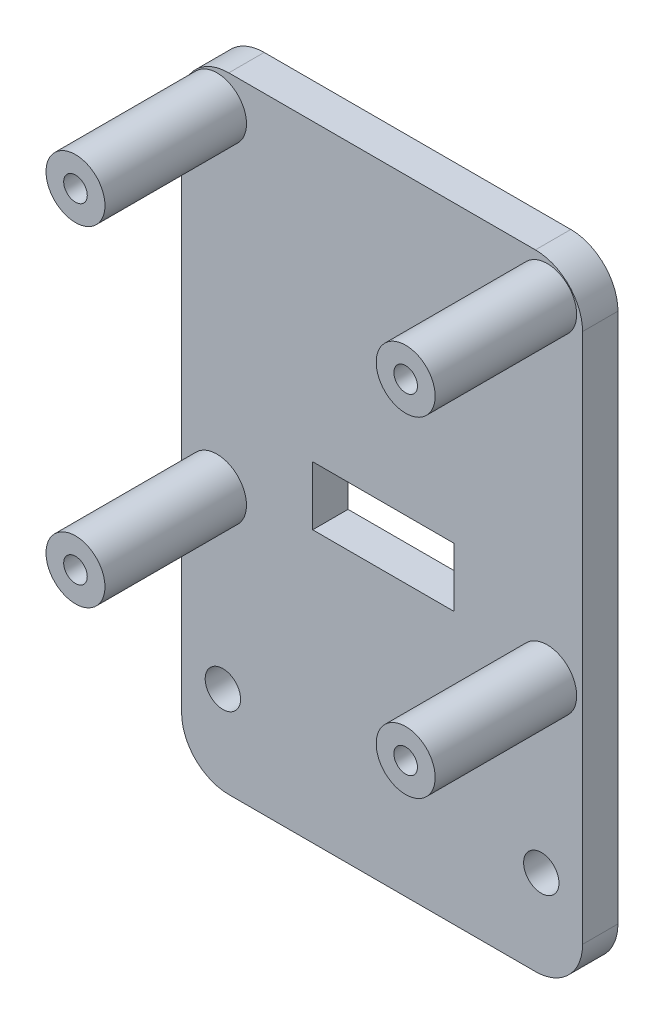
ISO-10303-21;
HEADER;
FILE_DESCRIPTION(('STEP AP214'),'2;1');
FILE_NAME('part.step','',(''),(''),'','','');
FILE_SCHEMA(('AUTOMOTIVE_DESIGN { 1 0 10303 214 1 1 1 1 }'));
ENDSEC;
DATA;
#1=APPLICATION_CONTEXT('core data for automotive mechanical design processes');
#2=APPLICATION_PROTOCOL_DEFINITION('international standard','automotive_design',2000,#1);
#3=PRODUCT_CONTEXT('',#1,'mechanical');
#4=PRODUCT('Part','Part','',(#3));
#5=PRODUCT_RELATED_PRODUCT_CATEGORY('part','',(#4));
#6=PRODUCT_DEFINITION_FORMATION('','',#4);
#7=PRODUCT_DEFINITION_CONTEXT('part definition',#1,'design');
#8=PRODUCT_DEFINITION('design','',#6,#7);
#9=PRODUCT_DEFINITION_SHAPE('','',#8);
#10=(LENGTH_UNIT() NAMED_UNIT(*) SI_UNIT(.MILLI.,.METRE.));
#11=(NAMED_UNIT(*) PLANE_ANGLE_UNIT() SI_UNIT($,.RADIAN.));
#12=(NAMED_UNIT(*) SI_UNIT($,.STERADIAN.) SOLID_ANGLE_UNIT());
#13=UNCERTAINTY_MEASURE_WITH_UNIT(LENGTH_MEASURE(1.E-05),#10,'distance_accuracy_value','');
#14=(GEOMETRIC_REPRESENTATION_CONTEXT(3) GLOBAL_UNCERTAINTY_ASSIGNED_CONTEXT((#13)) GLOBAL_UNIT_ASSIGNED_CONTEXT((#10,
#11,#12)) REPRESENTATION_CONTEXT('',''));
#15=CARTESIAN_POINT('',(0.,0.,0.));
#16=DIRECTION('',(0.,0.,1.));
#17=DIRECTION('',(1.,0.,0.));
#18=AXIS2_PLACEMENT_3D('',#15,#16,#17);
#19=CARTESIAN_POINT('',(-17.,0.,3.));
#20=DIRECTION('',(-1.,0.,0.));
#21=DIRECTION('',(0.,0.,1.));
#22=AXIS2_PLACEMENT_3D('',#19,#20,#21);
#23=PLANE('',#22);
#24=DIRECTION('',(0.,1.,0.));
#25=VECTOR('',#24,1.);
#26=CARTESIAN_POINT('',(-17.,0.,0.));
#27=LINE('',#26,#25);
#28=CARTESIAN_POINT('',(-17.,-3.5,0.));
#29=VERTEX_POINT('',#28);
#30=CARTESIAN_POINT('',(-17.,41.5,0.));
#31=VERTEX_POINT('',#30);
#32=EDGE_CURVE('E200',#29,#31,#27,.T.);
#33=ORIENTED_EDGE('',*,*,#32,.F.);
#34=DIRECTION('',(0.,0.,-1.));
#35=VECTOR('',#34,1.);
#36=CARTESIAN_POINT('',(-17.,-3.5,3.));
#37=LINE('',#36,#35);
#38=CARTESIAN_POINT('',(-17.,-3.5,3.));
#39=VERTEX_POINT('',#38);
#40=EDGE_CURVE('E267',#29,#39,#37,.F.);
#41=ORIENTED_EDGE('',*,*,#40,.T.);
#42=DIRECTION('',(0.,1.,0.));
#43=VECTOR('',#42,1.);
#44=CARTESIAN_POINT('',(-17.,0.,3.));
#45=LINE('',#44,#43);
#46=CARTESIAN_POINT('',(-17.,41.5,3.));
#47=VERTEX_POINT('',#46);
#48=EDGE_CURVE('E203',#39,#47,#45,.T.);
#49=ORIENTED_EDGE('',*,*,#48,.T.);
#50=DIRECTION('',(0.,0.,-1.));
#51=VECTOR('',#50,1.);
#52=CARTESIAN_POINT('',(-17.,41.5,3.));
#53=LINE('',#52,#51);
#54=EDGE_CURVE('E264',#47,#31,#53,.T.);
#55=ORIENTED_EDGE('',*,*,#54,.T.);
#56=EDGE_LOOP('',(#33,#41,#49,#55));
#57=FACE_BOUND('',#56,.T.);
#58=ADVANCED_FACE('F37',(#57),#23,.T.);
#59=CARTESIAN_POINT('',(0.,-7.5,3.));
#60=DIRECTION('',(0.,1.,0.));
#61=DIRECTION('',(0.,0.,1.));
#62=AXIS2_PLACEMENT_3D('',#59,#60,#61);
#63=PLANE('',#62);
#64=DIRECTION('',(1.,0.,0.));
#65=VECTOR('',#64,1.);
#66=CARTESIAN_POINT('',(0.,-7.5,0.));
#67=LINE('',#66,#65);
#68=CARTESIAN_POINT('',(-13.,-7.5,0.));
#69=VERTEX_POINT('',#68);
#70=CARTESIAN_POINT('',(13.,-7.5,0.));
#71=VERTEX_POINT('',#70);
#72=EDGE_CURVE('E225',#69,#71,#67,.T.);
#73=ORIENTED_EDGE('',*,*,#72,.T.);
#74=DIRECTION('',(0.,0.,-1.));
#75=VECTOR('',#74,1.);
#76=CARTESIAN_POINT('',(13.,-7.5,3.));
#77=LINE('',#76,#75);
#78=CARTESIAN_POINT('',(13.,-7.5,3.));
#79=VERTEX_POINT('',#78);
#80=EDGE_CURVE('E254',#71,#79,#77,.F.);
#81=ORIENTED_EDGE('',*,*,#80,.T.);
#82=DIRECTION('',(1.,0.,0.));
#83=VECTOR('',#82,1.);
#84=CARTESIAN_POINT('',(0.,-7.5,3.));
#85=LINE('',#84,#83);
#86=CARTESIAN_POINT('',(-13.,-7.5,3.));
#87=VERTEX_POINT('',#86);
#88=EDGE_CURVE('E206',#87,#79,#85,.T.);
#89=ORIENTED_EDGE('',*,*,#88,.F.);
#90=DIRECTION('',(0.,0.,-1.));
#91=VECTOR('',#90,1.);
#92=CARTESIAN_POINT('',(-13.,-7.5,0.));
#93=LINE('',#92,#91);
#94=EDGE_CURVE('E251',#87,#69,#93,.T.);
#95=ORIENTED_EDGE('',*,*,#94,.T.);
#96=EDGE_LOOP('',(#73,#81,#89,#95));
#97=FACE_BOUND('',#96,.T.);
#98=ADVANCED_FACE('F296',(#97),#63,.F.);
#99=CARTESIAN_POINT('',(17.,0.,3.));
#100=DIRECTION('',(-1.,0.,0.));
#101=DIRECTION('',(0.,0.,1.));
#102=AXIS2_PLACEMENT_3D('',#99,#100,#101);
#103=PLANE('',#102);
#104=DIRECTION('',(0.,1.,0.));
#105=VECTOR('',#104,1.);
#106=CARTESIAN_POINT('',(17.,0.,3.));
#107=LINE('',#106,#105);
#108=CARTESIAN_POINT('',(17.,-3.5,3.));
#109=VERTEX_POINT('',#108);
#110=CARTESIAN_POINT('',(17.,41.5,3.));
#111=VERTEX_POINT('',#110);
#112=EDGE_CURVE('E210',#109,#111,#107,.T.);
#113=ORIENTED_EDGE('',*,*,#112,.F.);
#114=DIRECTION('',(0.,0.,-1.));
#115=VECTOR('',#114,1.);
#116=CARTESIAN_POINT('',(17.,-3.5,3.));
#117=LINE('',#116,#115);
#118=CARTESIAN_POINT('',(17.,-3.5,0.));
#119=VERTEX_POINT('',#118);
#120=EDGE_CURVE('E240',#109,#119,#117,.T.);
#121=ORIENTED_EDGE('',*,*,#120,.T.);
#122=DIRECTION('',(0.,1.,0.));
#123=VECTOR('',#122,1.);
#124=CARTESIAN_POINT('',(17.,0.,0.));
#125=LINE('',#124,#123);
#126=CARTESIAN_POINT('',(17.,41.5,0.));
#127=VERTEX_POINT('',#126);
#128=EDGE_CURVE('E228',#119,#127,#125,.T.);
#129=ORIENTED_EDGE('',*,*,#128,.T.);
#130=DIRECTION('',(0.,0.,-1.));
#131=VECTOR('',#130,1.);
#132=CARTESIAN_POINT('',(17.,41.5,3.));
#133=LINE('',#132,#131);
#134=EDGE_CURVE('E222',#127,#111,#133,.F.);
#135=ORIENTED_EDGE('',*,*,#134,.T.);
#136=EDGE_LOOP('',(#113,#121,#129,#135));
#137=FACE_BOUND('',#136,.T.);
#138=ADVANCED_FACE('F302',(#137),#103,.F.);
#139=CARTESIAN_POINT('',(13.5,0.,3.));
#140=DIRECTION('',(0.,0.,-1.));
#141=DIRECTION('',(-1.,0.,0.));
#142=AXIS2_PLACEMENT_3D('',#139,#140,#141);
#143=CYLINDRICAL_SURFACE('',#142,1.5);
#144=CARTESIAN_POINT('',(13.5,0.,3.));
#145=DIRECTION('',(0.,0.,1.));
#146=DIRECTION('',(1.,0.,0.));
#147=AXIS2_PLACEMENT_3D('',#144,#145,#146);
#148=CIRCLE('',#147,1.5);
#149=CARTESIAN_POINT('',(15.,0.,3.));
#150=VERTEX_POINT('',#149);
#151=EDGE_CURVE('E216',#150,#150,#148,.T.);
#152=ORIENTED_EDGE('',*,*,#151,.T.);
#153=EDGE_LOOP('',(#152));
#154=FACE_BOUND('',#153,.T.);
#155=CARTESIAN_POINT('',(13.5,0.,0.));
#156=DIRECTION('',(0.,0.,1.));
#157=DIRECTION('',(1.,0.,0.));
#158=AXIS2_PLACEMENT_3D('',#155,#156,#157);
#159=CIRCLE('',#158,1.5);
#160=CARTESIAN_POINT('',(15.,0.,0.));
#161=VERTEX_POINT('',#160);
#162=EDGE_CURVE('E234',#161,#161,#159,.T.);
#163=ORIENTED_EDGE('',*,*,#162,.F.);
#164=EDGE_LOOP('',(#163));
#165=FACE_BOUND('',#164,.T.);
#166=ADVANCED_FACE('F361',(#154,#165),#143,.F.);
#167=CARTESIAN_POINT('',(0.,45.5,3.));
#168=DIRECTION('',(0.,1.,0.));
#169=DIRECTION('',(0.,0.,1.));
#170=AXIS2_PLACEMENT_3D('',#167,#168,#169);
#171=PLANE('',#170);
#172=DIRECTION('',(1.,0.,0.));
#173=VECTOR('',#172,1.);
#174=CARTESIAN_POINT('',(0.,45.5,3.));
#175=LINE('',#174,#173);
#176=CARTESIAN_POINT('',(-13.,45.5,3.));
#177=VERTEX_POINT('',#176);
#178=CARTESIAN_POINT('',(13.,45.5,3.));
#179=VERTEX_POINT('',#178);
#180=EDGE_CURVE('E213',#177,#179,#175,.T.);
#181=ORIENTED_EDGE('',*,*,#180,.T.);
#182=DIRECTION('',(0.,0.,-1.));
#183=VECTOR('',#182,1.);
#184=CARTESIAN_POINT('',(13.,45.5,0.));
#185=LINE('',#184,#183);
#186=CARTESIAN_POINT('',(13.,45.5,0.));
#187=VERTEX_POINT('',#186);
#188=EDGE_CURVE('E271',#179,#187,#185,.T.);
#189=ORIENTED_EDGE('',*,*,#188,.T.);
#190=DIRECTION('',(1.,0.,0.));
#191=VECTOR('',#190,1.);
#192=CARTESIAN_POINT('',(0.,45.5,0.));
#193=LINE('',#192,#191);
#194=CARTESIAN_POINT('',(-13.,45.5,0.));
#195=VERTEX_POINT('',#194);
#196=EDGE_CURVE('E231',#195,#187,#193,.T.);
#197=ORIENTED_EDGE('',*,*,#196,.F.);
#198=DIRECTION('',(0.,0.,-1.));
#199=VECTOR('',#198,1.);
#200=CARTESIAN_POINT('',(-13.,45.5,3.));
#201=LINE('',#200,#199);
#202=EDGE_CURVE('E269',#195,#177,#201,.F.);
#203=ORIENTED_EDGE('',*,*,#202,.T.);
#204=EDGE_LOOP('',(#181,#189,#197,#203));
#205=FACE_BOUND('',#204,.T.);
#206=ADVANCED_FACE('F329',(#205),#171,.T.);
#207=CARTESIAN_POINT('',(-13.5,0.,3.));
#208=DIRECTION('',(0.,0.,-1.));
#209=DIRECTION('',(-1.,0.,0.));
#210=AXIS2_PLACEMENT_3D('',#207,#208,#209);
#211=CYLINDRICAL_SURFACE('',#210,1.5);
#212=CARTESIAN_POINT('',(-13.5,0.,3.));
#213=DIRECTION('',(0.,0.,1.));
#214=DIRECTION('',(1.,0.,0.));
#215=AXIS2_PLACEMENT_3D('',#212,#213,#214);
#216=CIRCLE('',#215,1.5);
#217=CARTESIAN_POINT('',(-12.,0.,3.));
#218=VERTEX_POINT('',#217);
#219=EDGE_CURVE('E219',#218,#218,#216,.T.);
#220=ORIENTED_EDGE('',*,*,#219,.T.);
#221=EDGE_LOOP('',(#220));
#222=FACE_BOUND('',#221,.T.);
#223=CARTESIAN_POINT('',(-13.5,0.,0.));
#224=DIRECTION('',(0.,0.,1.));
#225=DIRECTION('',(1.,0.,0.));
#226=AXIS2_PLACEMENT_3D('',#223,#224,#225);
#227=CIRCLE('',#226,1.5);
#228=CARTESIAN_POINT('',(-12.,0.,0.));
#229=VERTEX_POINT('',#228);
#230=EDGE_CURVE('E207',#229,#229,#227,.T.);
#231=ORIENTED_EDGE('',*,*,#230,.F.);
#232=EDGE_LOOP('',(#231));
#233=FACE_BOUND('',#232,.T.);
#234=ADVANCED_FACE('F352',(#222,#233),#211,.F.);
#235=CARTESIAN_POINT('',(0.,0.,3.));
#236=DIRECTION('',(0.,0.,1.));
#237=DIRECTION('',(1.,0.,0.));
#238=AXIS2_PLACEMENT_3D('',#235,#236,#237);
#239=PLANE('',#238);
#240=DIRECTION('',(0.,1.,0.));
#241=VECTOR('',#240,1.);
#242=CARTESIAN_POINT('',(6.11419512494198,20.5,3.));
#243=LINE('',#242,#241);
#244=CARTESIAN_POINT('',(6.11419512494198,15.5,3.));
#245=VERTEX_POINT('',#244);
#246=CARTESIAN_POINT('',(6.11419512494198,20.5,3.));
#247=VERTEX_POINT('',#246);
#248=EDGE_CURVE('E52',#245,#247,#243,.T.);
#249=ORIENTED_EDGE('',*,*,#248,.F.);
#250=DIRECTION('',(1.,0.,0.));
#251=VECTOR('',#250,1.);
#252=CARTESIAN_POINT('',(-5.88580487505802,15.5,3.));
#253=LINE('',#252,#251);
#254=CARTESIAN_POINT('',(-5.88580487505802,15.5,3.));
#255=VERTEX_POINT('',#254);
#256=EDGE_CURVE('E145',#255,#245,#253,.T.);
#257=ORIENTED_EDGE('',*,*,#256,.F.);
#258=DIRECTION('',(0.,-1.,0.));
#259=VECTOR('',#258,1.);
#260=CARTESIAN_POINT('',(-5.88580487505802,20.5,3.));
#261=LINE('',#260,#259);
#262=CARTESIAN_POINT('',(-5.88580487505802,20.5,3.));
#263=VERTEX_POINT('',#262);
#264=EDGE_CURVE('E129',#263,#255,#261,.T.);
#265=ORIENTED_EDGE('',*,*,#264,.F.);
#266=DIRECTION('',(-1.,0.,0.));
#267=VECTOR('',#266,1.);
#268=CARTESIAN_POINT('',(-5.88580487505802,20.5,3.));
#269=LINE('',#268,#267);
#270=EDGE_CURVE('E138',#247,#263,#269,.T.);
#271=ORIENTED_EDGE('',*,*,#270,.F.);
#272=EDGE_LOOP('',(#249,#257,#265,#271));
#273=FACE_BOUND('',#272,.T.);
#274=CARTESIAN_POINT('',(14.,14.5,3.));
#275=DIRECTION('',(0.,0.,1.));
#276=DIRECTION('',(1.,0.,0.));
#277=AXIS2_PLACEMENT_3D('',#274,#275,#276);
#278=CIRCLE('',#277,2.5);
#279=CARTESIAN_POINT('',(16.5,14.5,3.));
#280=VERTEX_POINT('',#279);
#281=EDGE_CURVE('E176',#280,#280,#278,.T.);
#282=ORIENTED_EDGE('',*,*,#281,.F.);
#283=EDGE_LOOP('',(#282));
#284=FACE_BOUND('',#283,.T.);
#285=CARTESIAN_POINT('',(-14.,14.5,3.));
#286=DIRECTION('',(0.,0.,1.));
#287=DIRECTION('',(1.,0.,0.));
#288=AXIS2_PLACEMENT_3D('',#285,#286,#287);
#289=CIRCLE('',#288,2.5);
#290=CARTESIAN_POINT('',(-11.5,14.5,3.));
#291=VERTEX_POINT('',#290);
#292=EDGE_CURVE('E182',#291,#291,#289,.T.);
#293=ORIENTED_EDGE('',*,*,#292,.F.);
#294=EDGE_LOOP('',(#293));
#295=FACE_BOUND('',#294,.T.);
#296=CARTESIAN_POINT('',(14.,42.5,3.));
#297=DIRECTION('',(0.,0.,1.));
#298=DIRECTION('',(1.,0.,0.));
#299=AXIS2_PLACEMENT_3D('',#296,#297,#298);
#300=CIRCLE('',#299,2.5);
#301=CARTESIAN_POINT('',(16.5,42.5,3.));
#302=VERTEX_POINT('',#301);
#303=EDGE_CURVE('E188',#302,#302,#300,.T.);
#304=ORIENTED_EDGE('',*,*,#303,.F.);
#305=EDGE_LOOP('',(#304));
#306=FACE_BOUND('',#305,.T.);
#307=CARTESIAN_POINT('',(-14.,42.5,3.));
#308=DIRECTION('',(0.,0.,1.));
#309=DIRECTION('',(1.,0.,0.));
#310=AXIS2_PLACEMENT_3D('',#307,#308,#309);
#311=CIRCLE('',#310,2.5);
#312=CARTESIAN_POINT('',(-11.5,42.5,3.));
#313=VERTEX_POINT('',#312);
#314=EDGE_CURVE('E194',#313,#313,#311,.T.);
#315=ORIENTED_EDGE('',*,*,#314,.F.);
#316=EDGE_LOOP('',(#315));
#317=FACE_BOUND('',#316,.T.);
#318=ORIENTED_EDGE('',*,*,#88,.T.);
#319=CARTESIAN_POINT('',(13.,-3.5,3.));
#320=DIRECTION('',(0.,0.,1.));
#321=DIRECTION('',(1.,0.,0.));
#322=AXIS2_PLACEMENT_3D('',#319,#320,#321);
#323=CIRCLE('',#322,4.);
#324=EDGE_CURVE('E262',#79,#109,#323,.T.);
#325=ORIENTED_EDGE('',*,*,#324,.T.);
#326=ORIENTED_EDGE('',*,*,#112,.T.);
#327=CARTESIAN_POINT('',(13.,41.5,3.));
#328=DIRECTION('',(0.,0.,1.));
#329=DIRECTION('',(1.,0.,0.));
#330=AXIS2_PLACEMENT_3D('',#327,#328,#329);
#331=CIRCLE('',#330,4.);
#332=EDGE_CURVE('E258',#111,#179,#331,.T.);
#333=ORIENTED_EDGE('',*,*,#332,.T.);
#334=ORIENTED_EDGE('',*,*,#180,.F.);
#335=CARTESIAN_POINT('',(-13.,41.5,3.));
#336=DIRECTION('',(0.,0.,1.));
#337=DIRECTION('',(1.,0.,0.));
#338=AXIS2_PLACEMENT_3D('',#335,#336,#337);
#339=CIRCLE('',#338,4.);
#340=EDGE_CURVE('E256',#177,#47,#339,.T.);
#341=ORIENTED_EDGE('',*,*,#340,.T.);
#342=ORIENTED_EDGE('',*,*,#48,.F.);
#343=CARTESIAN_POINT('',(-13.,-3.5,3.));
#344=DIRECTION('',(0.,0.,1.));
#345=DIRECTION('',(1.,0.,0.));
#346=AXIS2_PLACEMENT_3D('',#343,#344,#345);
#347=CIRCLE('',#346,4.);
#348=EDGE_CURVE('E260',#39,#87,#347,.T.);
#349=ORIENTED_EDGE('',*,*,#348,.T.);
#350=EDGE_LOOP('',(#318,#325,#326,#333,#334,#341,#342,#349));
#351=FACE_BOUND('',#350,.T.);
#352=ORIENTED_EDGE('',*,*,#151,.F.);
#353=EDGE_LOOP('',(#352));
#354=FACE_BOUND('',#353,.T.);
#355=ORIENTED_EDGE('',*,*,#219,.F.);
#356=EDGE_LOOP('',(#355));
#357=FACE_BOUND('',#356,.T.);
#358=ADVANCED_FACE('F142',(#273,#284,#295,#306,#317,#351,#354,#357),#239,.T.);
#359=CARTESIAN_POINT('',(0.,0.,0.));
#360=DIRECTION('',(0.,0.,1.));
#361=DIRECTION('',(1.,0.,0.));
#362=AXIS2_PLACEMENT_3D('',#359,#360,#361);
#363=PLANE('',#362);
#364=DIRECTION('',(1.,0.,0.));
#365=VECTOR('',#364,1.);
#366=CARTESIAN_POINT('',(0.,15.5,0.));
#367=LINE('',#366,#365);
#368=CARTESIAN_POINT('',(-5.88580487505802,15.5,0.));
#369=VERTEX_POINT('',#368);
#370=CARTESIAN_POINT('',(6.11419512494198,15.5,0.));
#371=VERTEX_POINT('',#370);
#372=EDGE_CURVE('E45',#369,#371,#367,.T.);
#373=ORIENTED_EDGE('',*,*,#372,.T.);
#374=DIRECTION('',(0.,1.,0.));
#375=VECTOR('',#374,1.);
#376=CARTESIAN_POINT('',(6.11419512494199,0.,0.));
#377=LINE('',#376,#375);
#378=CARTESIAN_POINT('',(6.11419512494198,20.5,0.));
#379=VERTEX_POINT('',#378);
#380=EDGE_CURVE('E11',#371,#379,#377,.T.);
#381=ORIENTED_EDGE('',*,*,#380,.T.);
#382=DIRECTION('',(-1.,0.,0.));
#383=VECTOR('',#382,1.);
#384=CARTESIAN_POINT('',(0.,20.5,0.));
#385=LINE('',#384,#383);
#386=CARTESIAN_POINT('',(-5.88580487505802,20.5,0.));
#387=VERTEX_POINT('',#386);
#388=EDGE_CURVE('E274',#379,#387,#385,.T.);
#389=ORIENTED_EDGE('',*,*,#388,.T.);
#390=DIRECTION('',(0.,-1.,0.));
#391=VECTOR('',#390,1.);
#392=CARTESIAN_POINT('',(-5.88580487505802,0.,0.));
#393=LINE('',#392,#391);
#394=EDGE_CURVE('E132',#387,#369,#393,.T.);
#395=ORIENTED_EDGE('',*,*,#394,.T.);
#396=EDGE_LOOP('',(#373,#381,#389,#395));
#397=FACE_BOUND('',#396,.T.);
#398=ORIENTED_EDGE('',*,*,#128,.F.);
#399=CARTESIAN_POINT('',(13.,-3.5,0.));
#400=DIRECTION('',(0.,0.,1.));
#401=DIRECTION('',(1.,0.,0.));
#402=AXIS2_PLACEMENT_3D('',#399,#400,#401);
#403=CIRCLE('',#402,4.);
#404=EDGE_CURVE('E249',#119,#71,#403,.F.);
#405=ORIENTED_EDGE('',*,*,#404,.T.);
#406=ORIENTED_EDGE('',*,*,#72,.F.);
#407=CARTESIAN_POINT('',(-13.,-3.5,0.));
#408=DIRECTION('',(0.,0.,1.));
#409=DIRECTION('',(1.,0.,0.));
#410=AXIS2_PLACEMENT_3D('',#407,#408,#409);
#411=CIRCLE('',#410,4.);
#412=EDGE_CURVE('E247',#69,#29,#411,.F.);
#413=ORIENTED_EDGE('',*,*,#412,.T.);
#414=ORIENTED_EDGE('',*,*,#32,.T.);
#415=CARTESIAN_POINT('',(-13.,41.5,0.));
#416=DIRECTION('',(0.,0.,1.));
#417=DIRECTION('',(1.,0.,0.));
#418=AXIS2_PLACEMENT_3D('',#415,#416,#417);
#419=CIRCLE('',#418,4.);
#420=EDGE_CURVE('E243',#31,#195,#419,.F.);
#421=ORIENTED_EDGE('',*,*,#420,.T.);
#422=ORIENTED_EDGE('',*,*,#196,.T.);
#423=CARTESIAN_POINT('',(13.,41.5,0.));
#424=DIRECTION('',(0.,0.,1.));
#425=DIRECTION('',(1.,0.,0.));
#426=AXIS2_PLACEMENT_3D('',#423,#424,#425);
#427=CIRCLE('',#426,4.);
#428=EDGE_CURVE('E245',#187,#127,#427,.F.);
#429=ORIENTED_EDGE('',*,*,#428,.T.);
#430=EDGE_LOOP('',(#398,#405,#406,#413,#414,#421,#422,#429));
#431=FACE_BOUND('',#430,.T.);
#432=ORIENTED_EDGE('',*,*,#162,.T.);
#433=EDGE_LOOP('',(#432));
#434=FACE_BOUND('',#433,.T.);
#435=ORIENTED_EDGE('',*,*,#230,.T.);
#436=EDGE_LOOP('',(#435));
#437=FACE_BOUND('',#436,.T.);
#438=ADVANCED_FACE('F278',(#397,#431,#434,#437),#363,.F.);
#439=CARTESIAN_POINT('',(-14.,42.5,15.));
#440=DIRECTION('',(0.,0.,-1.));
#441=DIRECTION('',(-1.,0.,0.));
#442=AXIS2_PLACEMENT_3D('',#439,#440,#441);
#443=CYLINDRICAL_SURFACE('',#442,2.5);
#444=CARTESIAN_POINT('',(-14.,42.5,15.));
#445=DIRECTION('',(0.,0.,1.));
#446=DIRECTION('',(1.,0.,0.));
#447=AXIS2_PLACEMENT_3D('',#444,#445,#446);
#448=CIRCLE('',#447,2.5);
#449=CARTESIAN_POINT('',(-11.5,42.5,15.));
#450=VERTEX_POINT('',#449);
#451=EDGE_CURVE('E197',#450,#450,#448,.T.);
#452=ORIENTED_EDGE('',*,*,#451,.F.);
#453=EDGE_LOOP('',(#452));
#454=FACE_BOUND('',#453,.T.);
#455=ORIENTED_EDGE('',*,*,#314,.T.);
#456=EDGE_LOOP('',(#455));
#457=FACE_BOUND('',#456,.T.);
#458=ADVANCED_FACE('F346',(#454,#457),#443,.T.);
#459=CARTESIAN_POINT('',(-14.,42.5,15.));
#460=DIRECTION('',(0.,0.,1.));
#461=DIRECTION('',(1.,0.,0.));
#462=AXIS2_PLACEMENT_3D('',#459,#460,#461);
#463=PLANE('',#462);
#464=CARTESIAN_POINT('',(-14.,42.5,15.));
#465=DIRECTION('',(0.,0.,1.));
#466=DIRECTION('',(1.,0.,0.));
#467=AXIS2_PLACEMENT_3D('',#464,#465,#466);
#468=CIRCLE('',#467,1.);
#469=CARTESIAN_POINT('',(-13.,42.5,15.));
#470=VERTEX_POINT('',#469);
#471=EDGE_CURVE('E164',#470,#470,#468,.T.);
#472=ORIENTED_EDGE('',*,*,#471,.F.);
#473=EDGE_LOOP('',(#472));
#474=FACE_BOUND('',#473,.T.);
#475=ORIENTED_EDGE('',*,*,#451,.T.);
#476=EDGE_LOOP('',(#475));
#477=FACE_BOUND('',#476,.T.);
#478=ADVANCED_FACE('F452',(#474,#477),#463,.T.);
#479=CARTESIAN_POINT('',(14.,42.5,15.));
#480=DIRECTION('',(0.,0.,-1.));
#481=DIRECTION('',(-1.,0.,0.));
#482=AXIS2_PLACEMENT_3D('',#479,#480,#481);
#483=CYLINDRICAL_SURFACE('',#482,2.5);
#484=CARTESIAN_POINT('',(14.,42.5,15.));
#485=DIRECTION('',(0.,0.,1.));
#486=DIRECTION('',(1.,0.,0.));
#487=AXIS2_PLACEMENT_3D('',#484,#485,#486);
#488=CIRCLE('',#487,2.5);
#489=CARTESIAN_POINT('',(16.5,42.5,15.));
#490=VERTEX_POINT('',#489);
#491=EDGE_CURVE('E191',#490,#490,#488,.T.);
#492=ORIENTED_EDGE('',*,*,#491,.F.);
#493=EDGE_LOOP('',(#492));
#494=FACE_BOUND('',#493,.T.);
#495=ORIENTED_EDGE('',*,*,#303,.T.);
#496=EDGE_LOOP('',(#495));
#497=FACE_BOUND('',#496,.T.);
#498=ADVANCED_FACE('F460',(#494,#497),#483,.T.);
#499=CARTESIAN_POINT('',(14.,42.5,15.));
#500=DIRECTION('',(0.,0.,1.));
#501=DIRECTION('',(1.,0.,0.));
#502=AXIS2_PLACEMENT_3D('',#499,#500,#501);
#503=PLANE('',#502);
#504=CARTESIAN_POINT('',(14.,42.5,15.));
#505=DIRECTION('',(0.,0.,1.));
#506=DIRECTION('',(1.,0.,0.));
#507=AXIS2_PLACEMENT_3D('',#504,#505,#506);
#508=CIRCLE('',#507,1.);
#509=CARTESIAN_POINT('',(15.,42.5,15.));
#510=VERTEX_POINT('',#509);
#511=EDGE_CURVE('E165',#510,#510,#508,.T.);
#512=ORIENTED_EDGE('',*,*,#511,.F.);
#513=EDGE_LOOP('',(#512));
#514=FACE_BOUND('',#513,.T.);
#515=ORIENTED_EDGE('',*,*,#491,.T.);
#516=EDGE_LOOP('',(#515));
#517=FACE_BOUND('',#516,.T.);
#518=ADVANCED_FACE('F469',(#514,#517),#503,.T.);
#519=CARTESIAN_POINT('',(-14.,14.5,15.));
#520=DIRECTION('',(0.,0.,-1.));
#521=DIRECTION('',(-1.,0.,0.));
#522=AXIS2_PLACEMENT_3D('',#519,#520,#521);
#523=CYLINDRICAL_SURFACE('',#522,2.5);
#524=CARTESIAN_POINT('',(-14.,14.5,15.));
#525=DIRECTION('',(0.,0.,1.));
#526=DIRECTION('',(1.,0.,0.));
#527=AXIS2_PLACEMENT_3D('',#524,#525,#526);
#528=CIRCLE('',#527,2.5);
#529=CARTESIAN_POINT('',(-11.5,14.5,15.));
#530=VERTEX_POINT('',#529);
#531=EDGE_CURVE('E185',#530,#530,#528,.T.);
#532=ORIENTED_EDGE('',*,*,#531,.F.);
#533=EDGE_LOOP('',(#532));
#534=FACE_BOUND('',#533,.T.);
#535=ORIENTED_EDGE('',*,*,#292,.T.);
#536=EDGE_LOOP('',(#535));
#537=FACE_BOUND('',#536,.T.);
#538=ADVANCED_FACE('F477',(#534,#537),#523,.T.);
#539=CARTESIAN_POINT('',(-14.,14.5,15.));
#540=DIRECTION('',(0.,0.,1.));
#541=DIRECTION('',(1.,0.,0.));
#542=AXIS2_PLACEMENT_3D('',#539,#540,#541);
#543=PLANE('',#542);
#544=CARTESIAN_POINT('',(-14.,14.5,15.));
#545=DIRECTION('',(0.,0.,1.));
#546=DIRECTION('',(1.,0.,0.));
#547=AXIS2_PLACEMENT_3D('',#544,#545,#546);
#548=CIRCLE('',#547,0.999999999999999);
#549=CARTESIAN_POINT('',(-13.,14.5,15.));
#550=VERTEX_POINT('',#549);
#551=EDGE_CURVE('E158',#550,#550,#548,.T.);
#552=ORIENTED_EDGE('',*,*,#551,.F.);
#553=EDGE_LOOP('',(#552));
#554=FACE_BOUND('',#553,.T.);
#555=ORIENTED_EDGE('',*,*,#531,.T.);
#556=EDGE_LOOP('',(#555));
#557=FACE_BOUND('',#556,.T.);
#558=ADVANCED_FACE('F485',(#554,#557),#543,.T.);
#559=CARTESIAN_POINT('',(14.,14.5,15.));
#560=DIRECTION('',(0.,0.,-1.));
#561=DIRECTION('',(-1.,0.,0.));
#562=AXIS2_PLACEMENT_3D('',#559,#560,#561);
#563=CYLINDRICAL_SURFACE('',#562,2.5);
#564=CARTESIAN_POINT('',(14.,14.5,15.));
#565=DIRECTION('',(0.,0.,1.));
#566=DIRECTION('',(1.,0.,0.));
#567=AXIS2_PLACEMENT_3D('',#564,#565,#566);
#568=CIRCLE('',#567,2.5);
#569=CARTESIAN_POINT('',(16.5,14.5,15.));
#570=VERTEX_POINT('',#569);
#571=EDGE_CURVE('E179',#570,#570,#568,.T.);
#572=ORIENTED_EDGE('',*,*,#571,.F.);
#573=EDGE_LOOP('',(#572));
#574=FACE_BOUND('',#573,.T.);
#575=ORIENTED_EDGE('',*,*,#281,.T.);
#576=EDGE_LOOP('',(#575));
#577=FACE_BOUND('',#576,.T.);
#578=ADVANCED_FACE('F492',(#574,#577),#563,.T.);
#579=CARTESIAN_POINT('',(14.,14.5,15.));
#580=DIRECTION('',(0.,0.,1.));
#581=DIRECTION('',(1.,0.,0.));
#582=AXIS2_PLACEMENT_3D('',#579,#580,#581);
#583=PLANE('',#582);
#584=CARTESIAN_POINT('',(14.,14.5,15.));
#585=DIRECTION('',(0.,0.,1.));
#586=DIRECTION('',(1.,0.,0.));
#587=AXIS2_PLACEMENT_3D('',#584,#585,#586);
#588=CIRCLE('',#587,0.999999999999999);
#589=CARTESIAN_POINT('',(15.,14.5,15.));
#590=VERTEX_POINT('',#589);
#591=EDGE_CURVE('E152',#590,#590,#588,.T.);
#592=ORIENTED_EDGE('',*,*,#591,.F.);
#593=EDGE_LOOP('',(#592));
#594=FACE_BOUND('',#593,.T.);
#595=ORIENTED_EDGE('',*,*,#571,.T.);
#596=EDGE_LOOP('',(#595));
#597=FACE_BOUND('',#596,.T.);
#598=ADVANCED_FACE('F500',(#594,#597),#583,.T.);
#599=CARTESIAN_POINT('',(14.,14.5,7.));
#600=DIRECTION('',(0.,0.,1.));
#601=DIRECTION('',(1.,0.,0.));
#602=AXIS2_PLACEMENT_3D('',#599,#600,#601);
#603=CYLINDRICAL_SURFACE('',#602,0.999999999999999);
#604=CARTESIAN_POINT('',(14.,14.5,7.));
#605=DIRECTION('',(0.,0.,1.));
#606=DIRECTION('',(1.,0.,0.));
#607=AXIS2_PLACEMENT_3D('',#604,#605,#606);
#608=CIRCLE('',#607,0.999999999999999);
#609=CARTESIAN_POINT('',(15.,14.5,7.));
#610=VERTEX_POINT('',#609);
#611=EDGE_CURVE('E155',#610,#610,#608,.T.);
#612=ORIENTED_EDGE('',*,*,#611,.F.);
#613=EDGE_LOOP('',(#612));
#614=FACE_BOUND('',#613,.T.);
#615=ORIENTED_EDGE('',*,*,#591,.T.);
#616=EDGE_LOOP('',(#615));
#617=FACE_BOUND('',#616,.T.);
#618=ADVANCED_FACE('F507',(#614,#617),#603,.F.);
#619=CARTESIAN_POINT('',(14.,14.5,7.));
#620=DIRECTION('',(0.,0.,1.));
#621=DIRECTION('',(1.,0.,0.));
#622=AXIS2_PLACEMENT_3D('',#619,#620,#621);
#623=PLANE('',#622);
#624=ORIENTED_EDGE('',*,*,#611,.T.);
#625=EDGE_LOOP('',(#624));
#626=FACE_BOUND('',#625,.T.);
#627=ADVANCED_FACE('F515',(#626),#623,.T.);
#628=CARTESIAN_POINT('',(-14.,14.5,7.));
#629=DIRECTION('',(0.,0.,1.));
#630=DIRECTION('',(1.,0.,0.));
#631=AXIS2_PLACEMENT_3D('',#628,#629,#630);
#632=CYLINDRICAL_SURFACE('',#631,0.999999999999999);
#633=CARTESIAN_POINT('',(-14.,14.5,7.));
#634=DIRECTION('',(0.,0.,1.));
#635=DIRECTION('',(1.,0.,0.));
#636=AXIS2_PLACEMENT_3D('',#633,#634,#635);
#637=CIRCLE('',#636,0.999999999999999);
#638=CARTESIAN_POINT('',(-13.,14.5,7.));
#639=VERTEX_POINT('',#638);
#640=EDGE_CURVE('E168',#639,#639,#637,.T.);
#641=ORIENTED_EDGE('',*,*,#640,.F.);
#642=EDGE_LOOP('',(#641));
#643=FACE_BOUND('',#642,.T.);
#644=ORIENTED_EDGE('',*,*,#551,.T.);
#645=EDGE_LOOP('',(#644));
#646=FACE_BOUND('',#645,.T.);
#647=ADVANCED_FACE('F523',(#643,#646),#632,.F.);
#648=CARTESIAN_POINT('',(-14.,14.5,7.));
#649=DIRECTION('',(0.,0.,1.));
#650=DIRECTION('',(1.,0.,0.));
#651=AXIS2_PLACEMENT_3D('',#648,#649,#650);
#652=PLANE('',#651);
#653=ORIENTED_EDGE('',*,*,#640,.T.);
#654=EDGE_LOOP('',(#653));
#655=FACE_BOUND('',#654,.T.);
#656=ADVANCED_FACE('F530',(#655),#652,.T.);
#657=CARTESIAN_POINT('',(14.,42.5,7.));
#658=DIRECTION('',(0.,0.,1.));
#659=DIRECTION('',(1.,0.,0.));
#660=AXIS2_PLACEMENT_3D('',#657,#658,#659);
#661=CYLINDRICAL_SURFACE('',#660,1.);
#662=CARTESIAN_POINT('',(14.,42.5,7.));
#663=DIRECTION('',(0.,0.,1.));
#664=DIRECTION('',(1.,0.,0.));
#665=AXIS2_PLACEMENT_3D('',#662,#663,#664);
#666=CIRCLE('',#665,1.);
#667=CARTESIAN_POINT('',(15.,42.5,7.));
#668=VERTEX_POINT('',#667);
#669=EDGE_CURVE('E161',#668,#668,#666,.T.);
#670=ORIENTED_EDGE('',*,*,#669,.F.);
#671=EDGE_LOOP('',(#670));
#672=FACE_BOUND('',#671,.T.);
#673=ORIENTED_EDGE('',*,*,#511,.T.);
#674=EDGE_LOOP('',(#673));
#675=FACE_BOUND('',#674,.T.);
#676=ADVANCED_FACE('F538',(#672,#675),#661,.F.);
#677=CARTESIAN_POINT('',(14.,42.5,7.));
#678=DIRECTION('',(0.,0.,1.));
#679=DIRECTION('',(1.,0.,0.));
#680=AXIS2_PLACEMENT_3D('',#677,#678,#679);
#681=PLANE('',#680);
#682=ORIENTED_EDGE('',*,*,#669,.T.);
#683=EDGE_LOOP('',(#682));
#684=FACE_BOUND('',#683,.T.);
#685=ADVANCED_FACE('F546',(#684),#681,.T.);
#686=CARTESIAN_POINT('',(-14.,42.5,7.));
#687=DIRECTION('',(0.,0.,1.));
#688=DIRECTION('',(1.,0.,0.));
#689=AXIS2_PLACEMENT_3D('',#686,#687,#688);
#690=CYLINDRICAL_SURFACE('',#689,1.);
#691=CARTESIAN_POINT('',(-14.,42.5,7.));
#692=DIRECTION('',(0.,0.,1.));
#693=DIRECTION('',(1.,0.,0.));
#694=AXIS2_PLACEMENT_3D('',#691,#692,#693);
#695=CIRCLE('',#694,1.);
#696=CARTESIAN_POINT('',(-13.,42.5,7.));
#697=VERTEX_POINT('',#696);
#698=EDGE_CURVE('E173',#697,#697,#695,.T.);
#699=ORIENTED_EDGE('',*,*,#698,.F.);
#700=EDGE_LOOP('',(#699));
#701=FACE_BOUND('',#700,.T.);
#702=ORIENTED_EDGE('',*,*,#471,.T.);
#703=EDGE_LOOP('',(#702));
#704=FACE_BOUND('',#703,.T.);
#705=ADVANCED_FACE('F554',(#701,#704),#690,.F.);
#706=CARTESIAN_POINT('',(-14.,42.5,7.));
#707=DIRECTION('',(0.,0.,1.));
#708=DIRECTION('',(1.,0.,0.));
#709=AXIS2_PLACEMENT_3D('',#706,#707,#708);
#710=PLANE('',#709);
#711=ORIENTED_EDGE('',*,*,#698,.T.);
#712=EDGE_LOOP('',(#711));
#713=FACE_BOUND('',#712,.T.);
#714=ADVANCED_FACE('F312',(#713),#710,.T.);
#715=CARTESIAN_POINT('',(13.,-3.5,3.));
#716=DIRECTION('',(0.,0.,-1.));
#717=DIRECTION('',(-1.,0.,0.));
#718=AXIS2_PLACEMENT_3D('',#715,#716,#717);
#719=CYLINDRICAL_SURFACE('',#718,4.);
#720=ORIENTED_EDGE('',*,*,#324,.F.);
#721=ORIENTED_EDGE('',*,*,#80,.F.);
#722=ORIENTED_EDGE('',*,*,#404,.F.);
#723=ORIENTED_EDGE('',*,*,#120,.F.);
#724=EDGE_LOOP('',(#720,#721,#722,#723));
#725=FACE_BOUND('',#724,.T.);
#726=ADVANCED_FACE('F308',(#725),#719,.T.);
#727=CARTESIAN_POINT('',(-13.,-3.5,3.));
#728=DIRECTION('',(0.,0.,1.));
#729=DIRECTION('',(1.,0.,0.));
#730=AXIS2_PLACEMENT_3D('',#727,#728,#729);
#731=CYLINDRICAL_SURFACE('',#730,4.);
#732=ORIENTED_EDGE('',*,*,#348,.F.);
#733=ORIENTED_EDGE('',*,*,#40,.F.);
#734=ORIENTED_EDGE('',*,*,#412,.F.);
#735=ORIENTED_EDGE('',*,*,#94,.F.);
#736=EDGE_LOOP('',(#732,#733,#734,#735));
#737=FACE_BOUND('',#736,.T.);
#738=ADVANCED_FACE('F311',(#737),#731,.T.);
#739=CARTESIAN_POINT('',(13.,41.5,3.));
#740=DIRECTION('',(0.,0.,1.));
#741=DIRECTION('',(1.,0.,0.));
#742=AXIS2_PLACEMENT_3D('',#739,#740,#741);
#743=CYLINDRICAL_SURFACE('',#742,4.);
#744=ORIENTED_EDGE('',*,*,#332,.F.);
#745=ORIENTED_EDGE('',*,*,#134,.F.);
#746=ORIENTED_EDGE('',*,*,#428,.F.);
#747=ORIENTED_EDGE('',*,*,#188,.F.);
#748=EDGE_LOOP('',(#744,#745,#746,#747));
#749=FACE_BOUND('',#748,.T.);
#750=ADVANCED_FACE('F291',(#749),#743,.T.);
#751=CARTESIAN_POINT('',(-13.,41.5,3.));
#752=DIRECTION('',(0.,0.,-1.));
#753=DIRECTION('',(-1.,0.,0.));
#754=AXIS2_PLACEMENT_3D('',#751,#752,#753);
#755=CYLINDRICAL_SURFACE('',#754,4.);
#756=ORIENTED_EDGE('',*,*,#340,.F.);
#757=ORIENTED_EDGE('',*,*,#202,.F.);
#758=ORIENTED_EDGE('',*,*,#420,.F.);
#759=ORIENTED_EDGE('',*,*,#54,.F.);
#760=EDGE_LOOP('',(#756,#757,#758,#759));
#761=FACE_BOUND('',#760,.T.);
#762=ADVANCED_FACE('F39',(#761),#755,.T.);
#763=CARTESIAN_POINT('',(6.11419512494198,20.5,-5.));
#764=DIRECTION('',(1.,0.,0.));
#765=DIRECTION('',(0.,1.,0.));
#766=AXIS2_PLACEMENT_3D('',#763,#764,#765);
#767=PLANE('',#766);
#768=DIRECTION('',(0.,0.,1.));
#769=VECTOR('',#768,1.);
#770=CARTESIAN_POINT('',(6.11419512494198,15.5,-5.));
#771=LINE('',#770,#769);
#772=EDGE_CURVE('E150',#371,#245,#771,.T.);
#773=ORIENTED_EDGE('',*,*,#772,.T.);
#774=ORIENTED_EDGE('',*,*,#248,.T.);
#775=DIRECTION('',(0.,0.,1.));
#776=VECTOR('',#775,1.);
#777=CARTESIAN_POINT('',(6.11419512494198,20.5,-5.));
#778=LINE('',#777,#776);
#779=EDGE_CURVE('E135',#379,#247,#778,.T.);
#780=ORIENTED_EDGE('',*,*,#779,.F.);
#781=ORIENTED_EDGE('',*,*,#380,.F.);
#782=EDGE_LOOP('',(#773,#774,#780,#781));
#783=FACE_BOUND('',#782,.T.);
#784=ADVANCED_FACE('F283',(#783),#767,.F.);
#785=CARTESIAN_POINT('',(-5.88580487505802,15.5,-5.));
#786=DIRECTION('',(0.,-1.,0.));
#787=DIRECTION('',(1.,0.,0.));
#788=AXIS2_PLACEMENT_3D('',#785,#786,#787);
#789=PLANE('',#788);
#790=DIRECTION('',(0.,0.,1.));
#791=VECTOR('',#790,1.);
#792=CARTESIAN_POINT('',(-5.88580487505802,15.5,-5.));
#793=LINE('',#792,#791);
#794=EDGE_CURVE('E134',#369,#255,#793,.T.);
#795=ORIENTED_EDGE('',*,*,#794,.T.);
#796=ORIENTED_EDGE('',*,*,#256,.T.);
#797=ORIENTED_EDGE('',*,*,#772,.F.);
#798=ORIENTED_EDGE('',*,*,#372,.F.);
#799=EDGE_LOOP('',(#795,#796,#797,#798));
#800=FACE_BOUND('',#799,.T.);
#801=ADVANCED_FACE('F282',(#800),#789,.F.);
#802=CARTESIAN_POINT('',(-5.88580487505802,20.5,-5.));
#803=DIRECTION('',(-1.,0.,0.));
#804=DIRECTION('',(0.,-1.,0.));
#805=AXIS2_PLACEMENT_3D('',#802,#803,#804);
#806=PLANE('',#805);
#807=DIRECTION('',(0.,0.,1.));
#808=VECTOR('',#807,1.);
#809=CARTESIAN_POINT('',(-5.88580487505802,20.5,-5.));
#810=LINE('',#809,#808);
#811=EDGE_CURVE('E60',#387,#263,#810,.T.);
#812=ORIENTED_EDGE('',*,*,#811,.T.);
#813=ORIENTED_EDGE('',*,*,#264,.T.);
#814=ORIENTED_EDGE('',*,*,#794,.F.);
#815=ORIENTED_EDGE('',*,*,#394,.F.);
#816=EDGE_LOOP('',(#812,#813,#814,#815));
#817=FACE_BOUND('',#816,.T.);
#818=ADVANCED_FACE('F126',(#817),#806,.F.);
#819=CARTESIAN_POINT('',(-5.88580487505802,20.5,-5.));
#820=DIRECTION('',(0.,1.,0.));
#821=DIRECTION('',(0.,0.,1.));
#822=AXIS2_PLACEMENT_3D('',#819,#820,#821);
#823=PLANE('',#822);
#824=ORIENTED_EDGE('',*,*,#779,.T.);
#825=ORIENTED_EDGE('',*,*,#270,.T.);
#826=ORIENTED_EDGE('',*,*,#811,.F.);
#827=ORIENTED_EDGE('',*,*,#388,.F.);
#828=EDGE_LOOP('',(#824,#825,#826,#827));
#829=FACE_BOUND('',#828,.T.);
#830=ADVANCED_FACE('F139',(#829),#823,.F.);
#831=CLOSED_SHELL('',(#58,#98,#138,#166,#206,#234,#358,#438,#458,#478,#498,#518,#538,#558,#578,
#598,#618,#627,#647,#656,#676,#685,#705,#714,#726,#738,#750,#762,#784,#801,#818,#830));
#832=MANIFOLD_SOLID_BREP('B2',#831);
#833=ADVANCED_BREP_SHAPE_REPRESENTATION('',(#18,#832),#14);
#834=SHAPE_DEFINITION_REPRESENTATION(#9,#833);
ENDSEC;
END-ISO-10303-21;
